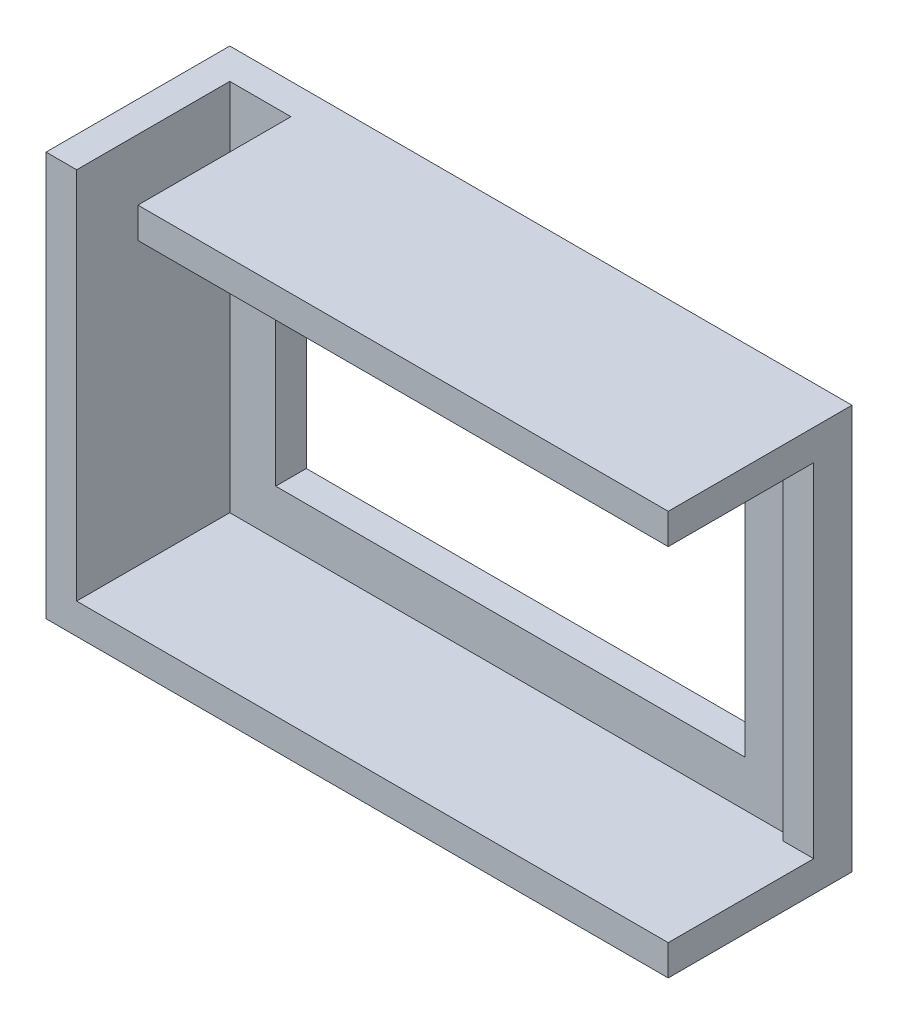
ISO-10303-21;
HEADER;
FILE_DESCRIPTION(('STEP AP214'),'2;1');
FILE_NAME('part.step','',(''),(''),'','','');
FILE_SCHEMA(('AUTOMOTIVE_DESIGN { 1 0 10303 214 1 1 1 1 }'));
ENDSEC;
DATA;
#1=APPLICATION_CONTEXT('core data for automotive mechanical design processes');
#2=APPLICATION_PROTOCOL_DEFINITION('international standard','automotive_design',2000,#1);
#3=PRODUCT_CONTEXT('',#1,'mechanical');
#4=PRODUCT('Part','Part','',(#3));
#5=PRODUCT_RELATED_PRODUCT_CATEGORY('part','',(#4));
#6=PRODUCT_DEFINITION_FORMATION('','',#4);
#7=PRODUCT_DEFINITION_CONTEXT('part definition',#1,'design');
#8=PRODUCT_DEFINITION('design','',#6,#7);
#9=PRODUCT_DEFINITION_SHAPE('','',#8);
#10=(LENGTH_UNIT() NAMED_UNIT(*) SI_UNIT(.MILLI.,.METRE.));
#11=(NAMED_UNIT(*) PLANE_ANGLE_UNIT() SI_UNIT($,.RADIAN.));
#12=(NAMED_UNIT(*) SI_UNIT($,.STERADIAN.) SOLID_ANGLE_UNIT());
#13=UNCERTAINTY_MEASURE_WITH_UNIT(LENGTH_MEASURE(1.E-05),#10,'distance_accuracy_value','');
#14=(GEOMETRIC_REPRESENTATION_CONTEXT(3) GLOBAL_UNCERTAINTY_ASSIGNED_CONTEXT((#13)) GLOBAL_UNIT_ASSIGNED_CONTEXT((#10,
#11,#12)) REPRESENTATION_CONTEXT('',''));
#15=CARTESIAN_POINT('',(0.,0.,0.));
#16=DIRECTION('',(0.,0.,1.));
#17=DIRECTION('',(1.,0.,0.));
#18=AXIS2_PLACEMENT_3D('',#15,#16,#17);
#19=CARTESIAN_POINT('',(0.,0.,6.));
#20=DIRECTION('',(0.,0.,-1.));
#21=DIRECTION('',(-1.,0.,0.));
#22=AXIS2_PLACEMENT_3D('',#19,#20,#21);
#23=PLANE('',#22);
#24=DIRECTION('',(-1.,0.,0.));
#25=VECTOR('',#24,1.);
#26=CARTESIAN_POINT('',(1.,12.2,6.));
#27=LINE('',#26,#25);
#28=CARTESIAN_POINT('',(20.32,12.2,6.));
#29=VERTEX_POINT('',#28);
#30=CARTESIAN_POINT('',(3.,12.2,6.));
#31=VERTEX_POINT('',#30);
#32=EDGE_CURVE('E224',#29,#31,#27,.T.);
#33=ORIENTED_EDGE('',*,*,#32,.F.);
#34=DIRECTION('',(0.,1.,0.));
#35=VECTOR('',#34,1.);
#36=CARTESIAN_POINT('',(20.32,0.,6.));
#37=LINE('',#36,#35);
#38=CARTESIAN_POINT('',(20.32,13.2,6.));
#39=VERTEX_POINT('',#38);
#40=EDGE_CURVE('E251',#29,#39,#37,.T.);
#41=ORIENTED_EDGE('',*,*,#40,.T.);
#42=DIRECTION('',(-1.,0.,0.));
#43=VECTOR('',#42,1.);
#44=CARTESIAN_POINT('',(0.,13.2,6.));
#45=LINE('',#44,#43);
#46=CARTESIAN_POINT('',(3.,13.2,6.));
#47=VERTEX_POINT('',#46);
#48=EDGE_CURVE('E255',#39,#47,#45,.T.);
#49=ORIENTED_EDGE('',*,*,#48,.T.);
#50=DIRECTION('',(0.,1.,0.));
#51=VECTOR('',#50,1.);
#52=CARTESIAN_POINT('',(3.,12.2,6.));
#53=LINE('',#52,#51);
#54=EDGE_CURVE('E197',#31,#47,#53,.T.);
#55=ORIENTED_EDGE('',*,*,#54,.F.);
#56=EDGE_LOOP('',(#33,#41,#49,#55));
#57=FACE_BOUND('',#56,.T.);
#58=ADVANCED_FACE('F33',(#57),#23,.F.);
#59=CARTESIAN_POINT('',(19.32,1.,1.));
#60=DIRECTION('',(1.,0.,0.));
#61=DIRECTION('',(0.,0.,-1.));
#62=AXIS2_PLACEMENT_3D('',#59,#60,#61);
#63=PLANE('',#62);
#64=DIRECTION('',(0.,-1.,0.));
#65=VECTOR('',#64,1.);
#66=CARTESIAN_POINT('',(19.32,12.2,1.25));
#67=LINE('',#66,#65);
#68=CARTESIAN_POINT('',(19.32,12.2,1.25));
#69=VERTEX_POINT('',#68);
#70=CARTESIAN_POINT('',(19.32,1.,1.25));
#71=VERTEX_POINT('',#70);
#72=EDGE_CURVE('E48',#69,#71,#67,.T.);
#73=ORIENTED_EDGE('',*,*,#72,.F.);
#74=DIRECTION('',(0.,0.,1.));
#75=VECTOR('',#74,1.);
#76=CARTESIAN_POINT('',(19.32,12.2,1.));
#77=LINE('',#76,#75);
#78=CARTESIAN_POINT('',(19.32,12.2,1.));
#79=VERTEX_POINT('',#78);
#80=EDGE_CURVE('E238',#79,#69,#77,.T.);
#81=ORIENTED_EDGE('',*,*,#80,.F.);
#82=DIRECTION('',(0.,1.,0.));
#83=VECTOR('',#82,1.);
#84=CARTESIAN_POINT('',(19.32,1.,1.));
#85=LINE('',#84,#83);
#86=CARTESIAN_POINT('',(19.32,1.,1.));
#87=VERTEX_POINT('',#86);
#88=EDGE_CURVE('E227',#87,#79,#85,.T.);
#89=ORIENTED_EDGE('',*,*,#88,.F.);
#90=DIRECTION('',(0.,0.,1.));
#91=VECTOR('',#90,1.);
#92=CARTESIAN_POINT('',(19.32,1.,1.));
#93=LINE('',#92,#91);
#94=EDGE_CURVE('E242',#87,#71,#93,.T.);
#95=ORIENTED_EDGE('',*,*,#94,.T.);
#96=EDGE_LOOP('',(#73,#81,#89,#95));
#97=FACE_BOUND('',#96,.T.);
#98=ADVANCED_FACE('F305',(#97),#63,.F.);
#99=CARTESIAN_POINT('',(0.,0.,6.));
#100=DIRECTION('',(1.,0.,0.));
#101=DIRECTION('',(0.,0.,-1.));
#102=AXIS2_PLACEMENT_3D('',#99,#100,#101);
#103=PLANE('',#102);
#104=DIRECTION('',(0.,-1.,0.));
#105=VECTOR('',#104,1.);
#106=CARTESIAN_POINT('',(0.,0.,0.));
#107=LINE('',#106,#105);
#108=CARTESIAN_POINT('',(0.,13.2,0.));
#109=VERTEX_POINT('',#108);
#110=CARTESIAN_POINT('',(0.,0.,0.));
#111=VERTEX_POINT('',#110);
#112=EDGE_CURVE('E241',#109,#111,#107,.T.);
#113=ORIENTED_EDGE('',*,*,#112,.T.);
#114=DIRECTION('',(0.,0.,-1.));
#115=VECTOR('',#114,1.);
#116=CARTESIAN_POINT('',(0.,0.,6.));
#117=LINE('',#116,#115);
#118=CARTESIAN_POINT('',(0.,0.,6.));
#119=VERTEX_POINT('',#118);
#120=EDGE_CURVE('E11',#119,#111,#117,.T.);
#121=ORIENTED_EDGE('',*,*,#120,.F.);
#122=DIRECTION('',(0.,-1.,0.));
#123=VECTOR('',#122,1.);
#124=CARTESIAN_POINT('',(0.,0.,6.));
#125=LINE('',#124,#123);
#126=CARTESIAN_POINT('',(0.,13.2,6.));
#127=VERTEX_POINT('',#126);
#128=EDGE_CURVE('E245',#127,#119,#125,.T.);
#129=ORIENTED_EDGE('',*,*,#128,.F.);
#130=DIRECTION('',(0.,0.,-1.));
#131=VECTOR('',#130,1.);
#132=CARTESIAN_POINT('',(0.,13.2,6.));
#133=LINE('',#132,#131);
#134=EDGE_CURVE('E258',#127,#109,#133,.T.);
#135=ORIENTED_EDGE('',*,*,#134,.T.);
#136=EDGE_LOOP('',(#113,#121,#129,#135));
#137=FACE_BOUND('',#136,.T.);
#138=ADVANCED_FACE('F35',(#137),#103,.F.);
#139=CARTESIAN_POINT('',(0.,0.,6.));
#140=DIRECTION('',(0.,1.,0.));
#141=DIRECTION('',(-1.,0.,0.));
#142=AXIS2_PLACEMENT_3D('',#139,#140,#141);
#143=PLANE('',#142);
#144=DIRECTION('',(1.,0.,0.));
#145=VECTOR('',#144,1.);
#146=CARTESIAN_POINT('',(0.,0.,0.));
#147=LINE('',#146,#145);
#148=CARTESIAN_POINT('',(20.32,0.,0.));
#149=VERTEX_POINT('',#148);
#150=EDGE_CURVE('E261',#111,#149,#147,.T.);
#151=ORIENTED_EDGE('',*,*,#150,.T.);
#152=DIRECTION('',(0.,0.,-1.));
#153=VECTOR('',#152,1.);
#154=CARTESIAN_POINT('',(20.32,0.,6.));
#155=LINE('',#154,#153);
#156=CARTESIAN_POINT('',(20.32,0.,6.));
#157=VERTEX_POINT('',#156);
#158=EDGE_CURVE('E41',#157,#149,#155,.T.);
#159=ORIENTED_EDGE('',*,*,#158,.F.);
#160=DIRECTION('',(1.,0.,0.));
#161=VECTOR('',#160,1.);
#162=CARTESIAN_POINT('',(0.,0.,6.));
#163=LINE('',#162,#161);
#164=EDGE_CURVE('E248',#119,#157,#163,.T.);
#165=ORIENTED_EDGE('',*,*,#164,.F.);
#166=ORIENTED_EDGE('',*,*,#120,.T.);
#167=EDGE_LOOP('',(#151,#159,#165,#166));
#168=FACE_BOUND('',#167,.T.);
#169=ADVANCED_FACE('F324',(#168),#143,.F.);
#170=CARTESIAN_POINT('',(20.32,0.,6.));
#171=DIRECTION('',(-1.,0.,0.));
#172=DIRECTION('',(0.,0.,1.));
#173=AXIS2_PLACEMENT_3D('',#170,#171,#172);
#174=PLANE('',#173);
#175=ORIENTED_EDGE('',*,*,#40,.F.);
#176=DIRECTION('',(0.,0.,1.));
#177=VECTOR('',#176,1.);
#178=CARTESIAN_POINT('',(20.32,12.2,1.25));
#179=LINE('',#178,#177);
#180=CARTESIAN_POINT('',(20.32,12.2,1.25));
#181=VERTEX_POINT('',#180);
#182=EDGE_CURVE('E157',#181,#29,#179,.T.);
#183=ORIENTED_EDGE('',*,*,#182,.F.);
#184=DIRECTION('',(0.,1.,0.));
#185=VECTOR('',#184,1.);
#186=CARTESIAN_POINT('',(20.32,12.2,1.25));
#187=LINE('',#186,#185);
#188=CARTESIAN_POINT('',(20.32,1.,1.25));
#189=VERTEX_POINT('',#188);
#190=EDGE_CURVE('E161',#189,#181,#187,.T.);
#191=ORIENTED_EDGE('',*,*,#190,.F.);
#192=DIRECTION('',(0.,0.,1.));
#193=VECTOR('',#192,1.);
#194=CARTESIAN_POINT('',(20.32,1.,1.25));
#195=LINE('',#194,#193);
#196=CARTESIAN_POINT('',(20.32,1.,6.));
#197=VERTEX_POINT('',#196);
#198=EDGE_CURVE('E146',#189,#197,#195,.T.);
#199=ORIENTED_EDGE('',*,*,#198,.T.);
#200=EDGE_CURVE('E252',#157,#197,#37,.T.);
#201=ORIENTED_EDGE('',*,*,#200,.F.);
#202=ORIENTED_EDGE('',*,*,#158,.T.);
#203=DIRECTION('',(0.,1.,0.));
#204=VECTOR('',#203,1.);
#205=CARTESIAN_POINT('',(20.32,0.,0.));
#206=LINE('',#205,#204);
#207=CARTESIAN_POINT('',(20.32,13.2,0.));
#208=VERTEX_POINT('',#207);
#209=EDGE_CURVE('E263',#149,#208,#206,.T.);
#210=ORIENTED_EDGE('',*,*,#209,.T.);
#211=DIRECTION('',(0.,0.,-1.));
#212=VECTOR('',#211,1.);
#213=CARTESIAN_POINT('',(20.32,13.2,6.));
#214=LINE('',#213,#212);
#215=EDGE_CURVE('E268',#39,#208,#214,.T.);
#216=ORIENTED_EDGE('',*,*,#215,.F.);
#217=EDGE_LOOP('',(#175,#183,#191,#199,#201,#202,#210,#216));
#218=FACE_BOUND('',#217,.T.);
#219=ADVANCED_FACE('F166',(#218),#174,.F.);
#220=CARTESIAN_POINT('',(0.,13.2,6.));
#221=DIRECTION('',(0.,-1.,0.));
#222=DIRECTION('',(0.,0.,-1.));
#223=AXIS2_PLACEMENT_3D('',#220,#221,#222);
#224=PLANE('',#223);
#225=CARTESIAN_POINT('',(1.,13.2,6.));
#226=VERTEX_POINT('',#225);
#227=EDGE_CURVE('E254',#226,#127,#45,.T.);
#228=ORIENTED_EDGE('',*,*,#227,.F.);
#229=DIRECTION('',(0.,0.,1.));
#230=VECTOR('',#229,1.);
#231=CARTESIAN_POINT('',(1.,13.2,1.));
#232=LINE('',#231,#230);
#233=CARTESIAN_POINT('',(1.,13.2,1.));
#234=VERTEX_POINT('',#233);
#235=EDGE_CURVE('E212',#234,#226,#232,.T.);
#236=ORIENTED_EDGE('',*,*,#235,.F.);
#237=DIRECTION('',(-1.,0.,0.));
#238=VECTOR('',#237,1.);
#239=CARTESIAN_POINT('',(1.,13.2,1.));
#240=LINE('',#239,#238);
#241=CARTESIAN_POINT('',(3.,13.2,1.));
#242=VERTEX_POINT('',#241);
#243=EDGE_CURVE('E207',#242,#234,#240,.T.);
#244=ORIENTED_EDGE('',*,*,#243,.F.);
#245=DIRECTION('',(0.,0.,1.));
#246=VECTOR('',#245,1.);
#247=CARTESIAN_POINT('',(3.,13.2,1.));
#248=LINE('',#247,#246);
#249=EDGE_CURVE('E216',#242,#47,#248,.T.);
#250=ORIENTED_EDGE('',*,*,#249,.T.);
#251=ORIENTED_EDGE('',*,*,#48,.F.);
#252=ORIENTED_EDGE('',*,*,#215,.T.);
#253=DIRECTION('',(-1.,0.,0.));
#254=VECTOR('',#253,1.);
#255=CARTESIAN_POINT('',(0.,13.2,0.));
#256=LINE('',#255,#254);
#257=EDGE_CURVE('E249',#208,#109,#256,.T.);
#258=ORIENTED_EDGE('',*,*,#257,.T.);
#259=ORIENTED_EDGE('',*,*,#134,.F.);
#260=EDGE_LOOP('',(#228,#236,#244,#250,#251,#252,#258,#259));
#261=FACE_BOUND('',#260,.T.);
#262=ADVANCED_FACE('F282',(#261),#224,.F.);
#263=ORIENTED_EDGE('',*,*,#200,.T.);
#264=DIRECTION('',(1.,0.,0.));
#265=VECTOR('',#264,1.);
#266=CARTESIAN_POINT('',(1.,1.,6.));
#267=LINE('',#266,#265);
#268=CARTESIAN_POINT('',(1.,1.,6.));
#269=VERTEX_POINT('',#268);
#270=EDGE_CURVE('E152',#269,#197,#267,.T.);
#271=ORIENTED_EDGE('',*,*,#270,.F.);
#272=DIRECTION('',(0.,-1.,0.));
#273=VECTOR('',#272,1.);
#274=CARTESIAN_POINT('',(1.,1.,6.));
#275=LINE('',#274,#273);
#276=EDGE_CURVE('E215',#226,#269,#275,.T.);
#277=ORIENTED_EDGE('',*,*,#276,.F.);
#278=ORIENTED_EDGE('',*,*,#227,.T.);
#279=ORIENTED_EDGE('',*,*,#128,.T.);
#280=ORIENTED_EDGE('',*,*,#164,.T.);
#281=EDGE_LOOP('',(#263,#271,#277,#278,#279,#280));
#282=FACE_BOUND('',#281,.T.);
#283=ADVANCED_FACE('F288',(#282),#23,.F.);
#284=CARTESIAN_POINT('',(0.,0.,0.));
#285=DIRECTION('',(0.,0.,-1.));
#286=DIRECTION('',(-1.,0.,0.));
#287=AXIS2_PLACEMENT_3D('',#284,#285,#286);
#288=PLANE('',#287);
#289=DIRECTION('',(0.,-1.,0.));
#290=VECTOR('',#289,1.);
#291=CARTESIAN_POINT('',(2.5,10.7,0.));
#292=LINE('',#291,#290);
#293=CARTESIAN_POINT('',(2.5,10.7,0.));
#294=VERTEX_POINT('',#293);
#295=CARTESIAN_POINT('',(2.5,2.5,0.));
#296=VERTEX_POINT('',#295);
#297=EDGE_CURVE('E174',#294,#296,#292,.T.);
#298=ORIENTED_EDGE('',*,*,#297,.T.);
#299=DIRECTION('',(1.,0.,0.));
#300=VECTOR('',#299,1.);
#301=CARTESIAN_POINT('',(2.5,2.5,0.));
#302=LINE('',#301,#300);
#303=CARTESIAN_POINT('',(17.82,2.5,0.));
#304=VERTEX_POINT('',#303);
#305=EDGE_CURVE('E177',#296,#304,#302,.T.);
#306=ORIENTED_EDGE('',*,*,#305,.T.);
#307=DIRECTION('',(0.,1.,0.));
#308=VECTOR('',#307,1.);
#309=CARTESIAN_POINT('',(17.82,10.7,0.));
#310=LINE('',#309,#308);
#311=CARTESIAN_POINT('',(17.82,10.7,0.));
#312=VERTEX_POINT('',#311);
#313=EDGE_CURVE('E56',#304,#312,#310,.T.);
#314=ORIENTED_EDGE('',*,*,#313,.T.);
#315=DIRECTION('',(-1.,0.,0.));
#316=VECTOR('',#315,1.);
#317=CARTESIAN_POINT('',(2.5,10.7,0.));
#318=LINE('',#317,#316);
#319=EDGE_CURVE('E182',#312,#294,#318,.T.);
#320=ORIENTED_EDGE('',*,*,#319,.T.);
#321=EDGE_LOOP('',(#298,#306,#314,#320));
#322=FACE_BOUND('',#321,.T.);
#323=ORIENTED_EDGE('',*,*,#112,.F.);
#324=ORIENTED_EDGE('',*,*,#257,.F.);
#325=ORIENTED_EDGE('',*,*,#209,.F.);
#326=ORIENTED_EDGE('',*,*,#150,.F.);
#327=EDGE_LOOP('',(#323,#324,#325,#326));
#328=FACE_BOUND('',#327,.T.);
#329=ADVANCED_FACE('F278',(#322,#328),#288,.T.);
#330=CARTESIAN_POINT('',(1.,1.,1.));
#331=DIRECTION('',(-1.,0.,0.));
#332=DIRECTION('',(0.,0.,1.));
#333=AXIS2_PLACEMENT_3D('',#330,#331,#332);
#334=PLANE('',#333);
#335=ORIENTED_EDGE('',*,*,#276,.T.);
#336=DIRECTION('',(0.,0.,1.));
#337=VECTOR('',#336,1.);
#338=CARTESIAN_POINT('',(1.,1.,1.));
#339=LINE('',#338,#337);
#340=CARTESIAN_POINT('',(1.,1.,1.));
#341=VERTEX_POINT('',#340);
#342=EDGE_CURVE('E233',#341,#269,#339,.T.);
#343=ORIENTED_EDGE('',*,*,#342,.F.);
#344=DIRECTION('',(0.,-1.,0.));
#345=VECTOR('',#344,1.);
#346=CARTESIAN_POINT('',(1.,1.,1.));
#347=LINE('',#346,#345);
#348=EDGE_CURVE('E220',#234,#341,#347,.T.);
#349=ORIENTED_EDGE('',*,*,#348,.F.);
#350=ORIENTED_EDGE('',*,*,#235,.T.);
#351=EDGE_LOOP('',(#335,#343,#349,#350));
#352=FACE_BOUND('',#351,.T.);
#353=ADVANCED_FACE('F292',(#352),#334,.F.);
#354=CARTESIAN_POINT('',(1.,12.2,1.));
#355=DIRECTION('',(0.,1.,0.));
#356=DIRECTION('',(0.,0.,1.));
#357=AXIS2_PLACEMENT_3D('',#354,#355,#356);
#358=PLANE('',#357);
#359=ORIENTED_EDGE('',*,*,#32,.T.);
#360=DIRECTION('',(0.,0.,1.));
#361=VECTOR('',#360,1.);
#362=CARTESIAN_POINT('',(3.,12.2,1.));
#363=LINE('',#362,#361);
#364=CARTESIAN_POINT('',(3.,12.2,1.));
#365=VERTEX_POINT('',#364);
#366=EDGE_CURVE('E210',#365,#31,#363,.T.);
#367=ORIENTED_EDGE('',*,*,#366,.F.);
#368=DIRECTION('',(-1.,0.,0.));
#369=VECTOR('',#368,1.);
#370=CARTESIAN_POINT('',(1.,12.2,1.));
#371=LINE('',#370,#369);
#372=EDGE_CURVE('E230',#79,#365,#371,.T.);
#373=ORIENTED_EDGE('',*,*,#372,.F.);
#374=ORIENTED_EDGE('',*,*,#80,.T.);
#375=DIRECTION('',(-1.,0.,0.));
#376=VECTOR('',#375,1.);
#377=CARTESIAN_POINT('',(19.32,12.2,1.25));
#378=LINE('',#377,#376);
#379=EDGE_CURVE('E158',#181,#69,#378,.T.);
#380=ORIENTED_EDGE('',*,*,#379,.F.);
#381=ORIENTED_EDGE('',*,*,#182,.T.);
#382=EDGE_LOOP('',(#359,#367,#373,#374,#380,#381));
#383=FACE_BOUND('',#382,.T.);
#384=ADVANCED_FACE('F302',(#383),#358,.F.);
#385=CARTESIAN_POINT('',(1.,1.,1.));
#386=DIRECTION('',(0.,-1.,0.));
#387=DIRECTION('',(0.,0.,-1.));
#388=AXIS2_PLACEMENT_3D('',#385,#386,#387);
#389=PLANE('',#388);
#390=ORIENTED_EDGE('',*,*,#270,.T.);
#391=ORIENTED_EDGE('',*,*,#198,.F.);
#392=DIRECTION('',(1.,0.,0.));
#393=VECTOR('',#392,1.);
#394=CARTESIAN_POINT('',(19.32,1.,1.25));
#395=LINE('',#394,#393);
#396=EDGE_CURVE('E148',#71,#189,#395,.T.);
#397=ORIENTED_EDGE('',*,*,#396,.F.);
#398=ORIENTED_EDGE('',*,*,#94,.F.);
#399=DIRECTION('',(1.,0.,0.));
#400=VECTOR('',#399,1.);
#401=CARTESIAN_POINT('',(1.,1.,1.));
#402=LINE('',#401,#400);
#403=EDGE_CURVE('E223',#341,#87,#402,.T.);
#404=ORIENTED_EDGE('',*,*,#403,.F.);
#405=ORIENTED_EDGE('',*,*,#342,.T.);
#406=EDGE_LOOP('',(#390,#391,#397,#398,#404,#405));
#407=FACE_BOUND('',#406,.T.);
#408=ADVANCED_FACE('F147',(#407),#389,.F.);
#409=CARTESIAN_POINT('',(0.,0.,1.));
#410=DIRECTION('',(0.,0.,-1.));
#411=DIRECTION('',(-1.,0.,0.));
#412=AXIS2_PLACEMENT_3D('',#409,#410,#411);
#413=PLANE('',#412);
#414=DIRECTION('',(1.,0.,0.));
#415=VECTOR('',#414,1.);
#416=CARTESIAN_POINT('',(2.5,2.5,1.));
#417=LINE('',#416,#415);
#418=CARTESIAN_POINT('',(2.5,2.5,1.));
#419=VERTEX_POINT('',#418);
#420=CARTESIAN_POINT('',(17.82,2.5,1.));
#421=VERTEX_POINT('',#420);
#422=EDGE_CURVE('E187',#419,#421,#417,.T.);
#423=ORIENTED_EDGE('',*,*,#422,.F.);
#424=DIRECTION('',(0.,-1.,0.));
#425=VECTOR('',#424,1.);
#426=CARTESIAN_POINT('',(2.5,10.7,1.));
#427=LINE('',#426,#425);
#428=CARTESIAN_POINT('',(2.5,10.7,1.));
#429=VERTEX_POINT('',#428);
#430=EDGE_CURVE('E172',#429,#419,#427,.T.);
#431=ORIENTED_EDGE('',*,*,#430,.F.);
#432=DIRECTION('',(-1.,0.,0.));
#433=VECTOR('',#432,1.);
#434=CARTESIAN_POINT('',(2.5,10.7,1.));
#435=LINE('',#434,#433);
#436=CARTESIAN_POINT('',(17.82,10.7,1.));
#437=VERTEX_POINT('',#436);
#438=EDGE_CURVE('E178',#437,#429,#435,.T.);
#439=ORIENTED_EDGE('',*,*,#438,.F.);
#440=DIRECTION('',(0.,1.,0.));
#441=VECTOR('',#440,1.);
#442=CARTESIAN_POINT('',(17.82,10.7,1.));
#443=LINE('',#442,#441);
#444=EDGE_CURVE('E190',#421,#437,#443,.T.);
#445=ORIENTED_EDGE('',*,*,#444,.F.);
#446=EDGE_LOOP('',(#423,#431,#439,#445));
#447=FACE_BOUND('',#446,.T.);
#448=ORIENTED_EDGE('',*,*,#348,.T.);
#449=ORIENTED_EDGE('',*,*,#403,.T.);
#450=ORIENTED_EDGE('',*,*,#88,.T.);
#451=ORIENTED_EDGE('',*,*,#372,.T.);
#452=DIRECTION('',(0.,1.,0.));
#453=VECTOR('',#452,1.);
#454=CARTESIAN_POINT('',(3.,12.2,1.));
#455=LINE('',#454,#453);
#456=EDGE_CURVE('E204',#365,#242,#455,.T.);
#457=ORIENTED_EDGE('',*,*,#456,.T.);
#458=ORIENTED_EDGE('',*,*,#243,.T.);
#459=EDGE_LOOP('',(#448,#449,#450,#451,#457,#458));
#460=FACE_BOUND('',#459,.T.);
#461=ADVANCED_FACE('F295',(#447,#460),#413,.F.);
#462=CARTESIAN_POINT('',(3.,12.2,1.));
#463=DIRECTION('',(1.,0.,0.));
#464=DIRECTION('',(0.,0.,-1.));
#465=AXIS2_PLACEMENT_3D('',#462,#463,#464);
#466=PLANE('',#465);
#467=ORIENTED_EDGE('',*,*,#54,.T.);
#468=ORIENTED_EDGE('',*,*,#249,.F.);
#469=ORIENTED_EDGE('',*,*,#456,.F.);
#470=ORIENTED_EDGE('',*,*,#366,.T.);
#471=EDGE_LOOP('',(#467,#468,#469,#470));
#472=FACE_BOUND('',#471,.T.);
#473=ADVANCED_FACE('F299',(#472),#466,.F.);
#474=CARTESIAN_POINT('',(2.5,10.7,0.));
#475=DIRECTION('',(-1.,0.,0.));
#476=DIRECTION('',(0.,-1.,0.));
#477=AXIS2_PLACEMENT_3D('',#474,#475,#476);
#478=PLANE('',#477);
#479=ORIENTED_EDGE('',*,*,#430,.T.);
#480=DIRECTION('',(0.,0.,1.));
#481=VECTOR('',#480,1.);
#482=CARTESIAN_POINT('',(2.5,2.5,0.));
#483=LINE('',#482,#481);
#484=EDGE_CURVE('E185',#296,#419,#483,.T.);
#485=ORIENTED_EDGE('',*,*,#484,.F.);
#486=ORIENTED_EDGE('',*,*,#297,.F.);
#487=DIRECTION('',(0.,0.,1.));
#488=VECTOR('',#487,1.);
#489=CARTESIAN_POINT('',(2.5,10.7,0.));
#490=LINE('',#489,#488);
#491=EDGE_CURVE('E195',#294,#429,#490,.T.);
#492=ORIENTED_EDGE('',*,*,#491,.T.);
#493=EDGE_LOOP('',(#479,#485,#486,#492));
#494=FACE_BOUND('',#493,.T.);
#495=ADVANCED_FACE('F403',(#494),#478,.F.);
#496=CARTESIAN_POINT('',(2.5,10.7,0.));
#497=DIRECTION('',(0.,1.,0.));
#498=DIRECTION('',(0.,0.,1.));
#499=AXIS2_PLACEMENT_3D('',#496,#497,#498);
#500=PLANE('',#499);
#501=ORIENTED_EDGE('',*,*,#438,.T.);
#502=ORIENTED_EDGE('',*,*,#491,.F.);
#503=ORIENTED_EDGE('',*,*,#319,.F.);
#504=DIRECTION('',(0.,0.,1.));
#505=VECTOR('',#504,1.);
#506=CARTESIAN_POINT('',(17.82,10.7,0.));
#507=LINE('',#506,#505);
#508=EDGE_CURVE('E198',#312,#437,#507,.T.);
#509=ORIENTED_EDGE('',*,*,#508,.T.);
#510=EDGE_LOOP('',(#501,#502,#503,#509));
#511=FACE_BOUND('',#510,.T.);
#512=ADVANCED_FACE('F396',(#511),#500,.F.);
#513=CARTESIAN_POINT('',(17.82,10.7,0.));
#514=DIRECTION('',(1.,0.,0.));
#515=DIRECTION('',(0.,0.,-1.));
#516=AXIS2_PLACEMENT_3D('',#513,#514,#515);
#517=PLANE('',#516);
#518=ORIENTED_EDGE('',*,*,#444,.T.);
#519=ORIENTED_EDGE('',*,*,#508,.F.);
#520=ORIENTED_EDGE('',*,*,#313,.F.);
#521=DIRECTION('',(0.,0.,1.));
#522=VECTOR('',#521,1.);
#523=CARTESIAN_POINT('',(17.82,2.5,0.));
#524=LINE('',#523,#522);
#525=EDGE_CURVE('E200',#304,#421,#524,.T.);
#526=ORIENTED_EDGE('',*,*,#525,.T.);
#527=EDGE_LOOP('',(#518,#519,#520,#526));
#528=FACE_BOUND('',#527,.T.);
#529=ADVANCED_FACE('F389',(#528),#517,.F.);
#530=CARTESIAN_POINT('',(2.5,2.5,0.));
#531=DIRECTION('',(0.,-1.,0.));
#532=DIRECTION('',(0.,0.,-1.));
#533=AXIS2_PLACEMENT_3D('',#530,#531,#532);
#534=PLANE('',#533);
#535=ORIENTED_EDGE('',*,*,#422,.T.);
#536=ORIENTED_EDGE('',*,*,#525,.F.);
#537=ORIENTED_EDGE('',*,*,#305,.F.);
#538=ORIENTED_EDGE('',*,*,#484,.T.);
#539=EDGE_LOOP('',(#535,#536,#537,#538));
#540=FACE_BOUND('',#539,.T.);
#541=ADVANCED_FACE('F381',(#540),#534,.F.);
#542=CARTESIAN_POINT('',(0.,0.,1.25));
#543=DIRECTION('',(0.,0.,1.));
#544=DIRECTION('',(1.,0.,0.));
#545=AXIS2_PLACEMENT_3D('',#542,#543,#544);
#546=PLANE('',#545);
#547=ORIENTED_EDGE('',*,*,#72,.T.);
#548=ORIENTED_EDGE('',*,*,#396,.T.);
#549=ORIENTED_EDGE('',*,*,#190,.T.);
#550=ORIENTED_EDGE('',*,*,#379,.T.);
#551=EDGE_LOOP('',(#547,#548,#549,#550));
#552=FACE_BOUND('',#551,.T.);
#553=ADVANCED_FACE('F160',(#552),#546,.T.);
#554=CLOSED_SHELL('',(#58,#98,#138,#169,#219,#262,#283,#329,#353,#384,#408,#461,#473,#495,#512,
#529,#541,#553));
#555=MANIFOLD_SOLID_BREP('B2',#554);
#556=ADVANCED_BREP_SHAPE_REPRESENTATION('',(#18,#555),#14);
#557=SHAPE_DEFINITION_REPRESENTATION(#9,#556);
ENDSEC;
END-ISO-10303-21;
